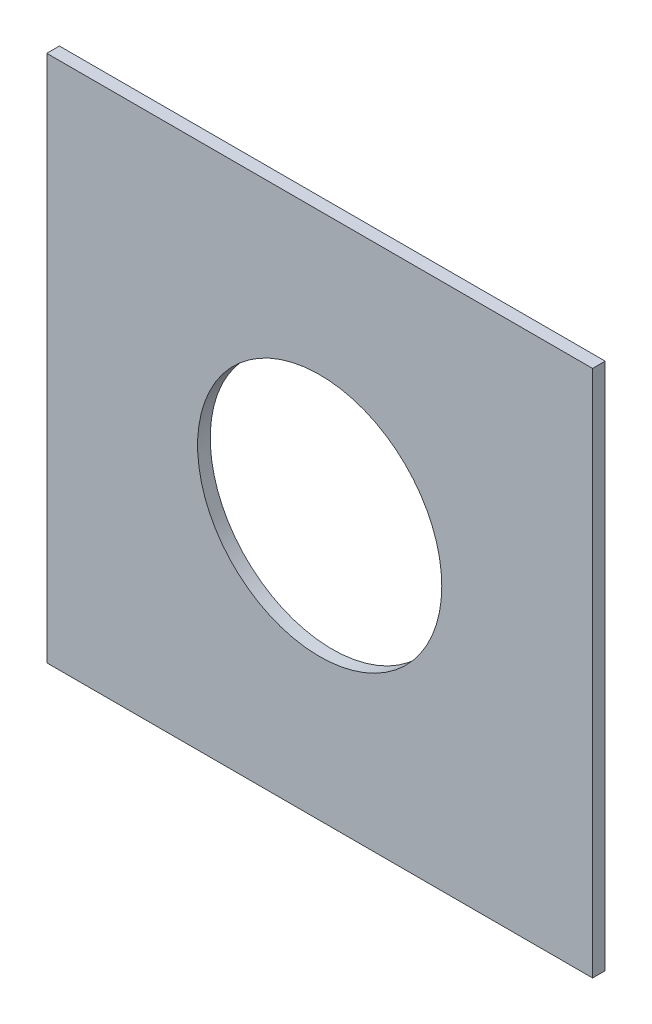
ISO-10303-21;
HEADER;
FILE_DESCRIPTION(('STEP AP214'),'2;1');
FILE_NAME('part.step','',(''),(''),'','','');
FILE_SCHEMA(('AUTOMOTIVE_DESIGN { 1 0 10303 214 1 1 1 1 }'));
ENDSEC;
DATA;
#1=APPLICATION_CONTEXT('core data for automotive mechanical design processes');
#2=APPLICATION_PROTOCOL_DEFINITION('international standard','automotive_design',2000,#1);
#3=PRODUCT_CONTEXT('',#1,'mechanical');
#4=PRODUCT('Part','Part','',(#3));
#5=PRODUCT_RELATED_PRODUCT_CATEGORY('part','',(#4));
#6=PRODUCT_DEFINITION_FORMATION('','',#4);
#7=PRODUCT_DEFINITION_CONTEXT('part definition',#1,'design');
#8=PRODUCT_DEFINITION('design','',#6,#7);
#9=PRODUCT_DEFINITION_SHAPE('','',#8);
#10=(LENGTH_UNIT() NAMED_UNIT(*) SI_UNIT(.MILLI.,.METRE.));
#11=(NAMED_UNIT(*) PLANE_ANGLE_UNIT() SI_UNIT($,.RADIAN.));
#12=(NAMED_UNIT(*) SI_UNIT($,.STERADIAN.) SOLID_ANGLE_UNIT());
#13=UNCERTAINTY_MEASURE_WITH_UNIT(LENGTH_MEASURE(1.E-05),#10,'distance_accuracy_value','');
#14=(GEOMETRIC_REPRESENTATION_CONTEXT(3) GLOBAL_UNCERTAINTY_ASSIGNED_CONTEXT((#13)) GLOBAL_UNIT_ASSIGNED_CONTEXT((#10,
#11,#12)) REPRESENTATION_CONTEXT('',''));
#15=CARTESIAN_POINT('',(0.,0.,0.));
#16=DIRECTION('',(0.,0.,1.));
#17=DIRECTION('',(1.,0.,0.));
#18=AXIS2_PLACEMENT_3D('',#15,#16,#17);
#19=CARTESIAN_POINT('',(120.65,-116.6880064,5.588));
#20=DIRECTION('',(-1.,0.,0.));
#21=DIRECTION('',(0.,0.,1.));
#22=AXIS2_PLACEMENT_3D('',#19,#20,#21);
#23=PLANE('',#22);
#24=DIRECTION('',(0.,1.,0.));
#25=VECTOR('',#24,1.);
#26=CARTESIAN_POINT('',(120.65,-116.6880064,0.));
#27=LINE('',#26,#25);
#28=CARTESIAN_POINT('',(120.65,-116.6880064,0.));
#29=VERTEX_POINT('',#28);
#30=CARTESIAN_POINT('',(120.65,116.6880064,0.));
#31=VERTEX_POINT('',#30);
#32=EDGE_CURVE('E100',#29,#31,#27,.T.);
#33=ORIENTED_EDGE('',*,*,#32,.T.);
#34=DIRECTION('',(0.,0.,-1.));
#35=VECTOR('',#34,1.);
#36=CARTESIAN_POINT('',(120.65,116.6880064,5.588));
#37=LINE('',#36,#35);
#38=CARTESIAN_POINT('',(120.65,116.6880064,5.588));
#39=VERTEX_POINT('',#38);
#40=EDGE_CURVE('E11',#39,#31,#37,.T.);
#41=ORIENTED_EDGE('',*,*,#40,.F.);
#42=DIRECTION('',(0.,1.,0.));
#43=VECTOR('',#42,1.);
#44=CARTESIAN_POINT('',(120.65,-116.6880064,5.588));
#45=LINE('',#44,#43);
#46=CARTESIAN_POINT('',(120.65,-116.6880064,5.588));
#47=VERTEX_POINT('',#46);
#48=EDGE_CURVE('E88',#47,#39,#45,.T.);
#49=ORIENTED_EDGE('',*,*,#48,.F.);
#50=DIRECTION('',(0.,0.,-1.));
#51=VECTOR('',#50,1.);
#52=CARTESIAN_POINT('',(120.65,-116.6880064,5.588));
#53=LINE('',#52,#51);
#54=EDGE_CURVE('E96',#47,#29,#53,.T.);
#55=ORIENTED_EDGE('',*,*,#54,.T.);
#56=EDGE_LOOP('',(#33,#41,#49,#55));
#57=FACE_BOUND('',#56,.T.);
#58=ADVANCED_FACE('F37',(#57),#23,.F.);
#59=CARTESIAN_POINT('',(-120.65,116.6880064,5.588));
#60=DIRECTION('',(0.,-1.,0.));
#61=DIRECTION('',(0.,0.,-1.));
#62=AXIS2_PLACEMENT_3D('',#59,#60,#61);
#63=PLANE('',#62);
#64=DIRECTION('',(-1.,0.,0.));
#65=VECTOR('',#64,1.);
#66=CARTESIAN_POINT('',(-120.65,116.6880064,0.));
#67=LINE('',#66,#65);
#68=CARTESIAN_POINT('',(-120.65,116.6880064,0.));
#69=VERTEX_POINT('',#68);
#70=EDGE_CURVE('E92',#31,#69,#67,.T.);
#71=ORIENTED_EDGE('',*,*,#70,.T.);
#72=DIRECTION('',(0.,0.,-1.));
#73=VECTOR('',#72,1.);
#74=CARTESIAN_POINT('',(-120.65,116.6880064,5.588));
#75=LINE('',#74,#73);
#76=CARTESIAN_POINT('',(-120.65,116.6880064,5.588));
#77=VERTEX_POINT('',#76);
#78=EDGE_CURVE('E45',#77,#69,#75,.T.);
#79=ORIENTED_EDGE('',*,*,#78,.F.);
#80=DIRECTION('',(-1.,0.,0.));
#81=VECTOR('',#80,1.);
#82=CARTESIAN_POINT('',(-120.65,116.6880064,5.588));
#83=LINE('',#82,#81);
#84=EDGE_CURVE('E83',#39,#77,#83,.T.);
#85=ORIENTED_EDGE('',*,*,#84,.F.);
#86=ORIENTED_EDGE('',*,*,#40,.T.);
#87=EDGE_LOOP('',(#71,#79,#85,#86));
#88=FACE_BOUND('',#87,.T.);
#89=ADVANCED_FACE('F91',(#88),#63,.F.);
#90=CARTESIAN_POINT('',(-120.65,-116.6880064,5.588));
#91=DIRECTION('',(1.,0.,0.));
#92=DIRECTION('',(0.,0.,-1.));
#93=AXIS2_PLACEMENT_3D('',#90,#91,#92);
#94=PLANE('',#93);
#95=DIRECTION('',(0.,-1.,0.));
#96=VECTOR('',#95,1.);
#97=CARTESIAN_POINT('',(-120.65,-116.6880064,0.));
#98=LINE('',#97,#96);
#99=CARTESIAN_POINT('',(-120.65,-116.6880064,0.));
#100=VERTEX_POINT('',#99);
#101=EDGE_CURVE('E70',#69,#100,#98,.T.);
#102=ORIENTED_EDGE('',*,*,#101,.T.);
#103=DIRECTION('',(0.,0.,-1.));
#104=VECTOR('',#103,1.);
#105=CARTESIAN_POINT('',(-120.65,-116.6880064,5.588));
#106=LINE('',#105,#104);
#107=CARTESIAN_POINT('',(-120.65,-116.6880064,5.588));
#108=VERTEX_POINT('',#107);
#109=EDGE_CURVE('E93',#108,#100,#106,.T.);
#110=ORIENTED_EDGE('',*,*,#109,.F.);
#111=DIRECTION('',(0.,-1.,0.));
#112=VECTOR('',#111,1.);
#113=CARTESIAN_POINT('',(-120.65,-116.6880064,5.588));
#114=LINE('',#113,#112);
#115=EDGE_CURVE('E86',#77,#108,#114,.T.);
#116=ORIENTED_EDGE('',*,*,#115,.F.);
#117=ORIENTED_EDGE('',*,*,#78,.T.);
#118=EDGE_LOOP('',(#102,#110,#116,#117));
#119=FACE_BOUND('',#118,.T.);
#120=ADVANCED_FACE('F94',(#119),#94,.F.);
#121=CARTESIAN_POINT('',(-120.65,-116.6880064,5.588));
#122=DIRECTION('',(0.,1.,0.));
#123=DIRECTION('',(0.,0.,1.));
#124=AXIS2_PLACEMENT_3D('',#121,#122,#123);
#125=PLANE('',#124);
#126=DIRECTION('',(1.,0.,0.));
#127=VECTOR('',#126,1.);
#128=CARTESIAN_POINT('',(-120.65,-116.6880064,0.));
#129=LINE('',#128,#127);
#130=EDGE_CURVE('E76',#100,#29,#129,.T.);
#131=ORIENTED_EDGE('',*,*,#130,.T.);
#132=ORIENTED_EDGE('',*,*,#54,.F.);
#133=DIRECTION('',(1.,0.,0.));
#134=VECTOR('',#133,1.);
#135=CARTESIAN_POINT('',(-120.65,-116.6880064,5.588));
#136=LINE('',#135,#134);
#137=EDGE_CURVE('E53',#108,#47,#136,.T.);
#138=ORIENTED_EDGE('',*,*,#137,.F.);
#139=ORIENTED_EDGE('',*,*,#109,.T.);
#140=EDGE_LOOP('',(#131,#132,#138,#139));
#141=FACE_BOUND('',#140,.T.);
#142=ADVANCED_FACE('F108',(#141),#125,.F.);
#143=CARTESIAN_POINT('',(0.,0.,5.588));
#144=DIRECTION('',(0.,0.,-1.));
#145=DIRECTION('',(-1.,0.,0.));
#146=AXIS2_PLACEMENT_3D('',#143,#144,#145);
#147=PLANE('',#146);
#148=CARTESIAN_POINT('',(0.,0.,5.588));
#149=DIRECTION('',(0.,0.,1.));
#150=DIRECTION('',(1.,0.,0.));
#151=AXIS2_PLACEMENT_3D('',#148,#149,#150);
#152=CIRCLE('',#151,53.975);
#153=CARTESIAN_POINT('',(53.975,0.,5.588));
#154=VERTEX_POINT('',#153);
#155=EDGE_CURVE('E114',#154,#154,#152,.T.);
#156=ORIENTED_EDGE('',*,*,#155,.F.);
#157=EDGE_LOOP('',(#156));
#158=FACE_BOUND('',#157,.T.);
#159=ORIENTED_EDGE('',*,*,#48,.T.);
#160=ORIENTED_EDGE('',*,*,#84,.T.);
#161=ORIENTED_EDGE('',*,*,#115,.T.);
#162=ORIENTED_EDGE('',*,*,#137,.T.);
#163=EDGE_LOOP('',(#159,#160,#161,#162));
#164=FACE_BOUND('',#163,.T.);
#165=ADVANCED_FACE('F84',(#158,#164),#147,.F.);
#166=CARTESIAN_POINT('',(0.,0.,0.));
#167=DIRECTION('',(0.,0.,-1.));
#168=DIRECTION('',(-1.,0.,0.));
#169=AXIS2_PLACEMENT_3D('',#166,#167,#168);
#170=PLANE('',#169);
#171=CARTESIAN_POINT('',(0.,0.,0.));
#172=DIRECTION('',(0.,0.,1.));
#173=DIRECTION('',(1.,0.,0.));
#174=AXIS2_PLACEMENT_3D('',#171,#172,#173);
#175=CIRCLE('',#174,53.975);
#176=CARTESIAN_POINT('',(53.975,0.,0.));
#177=VERTEX_POINT('',#176);
#178=EDGE_CURVE('E103',#177,#177,#175,.T.);
#179=ORIENTED_EDGE('',*,*,#178,.T.);
#180=EDGE_LOOP('',(#179));
#181=FACE_BOUND('',#180,.T.);
#182=ORIENTED_EDGE('',*,*,#32,.F.);
#183=ORIENTED_EDGE('',*,*,#130,.F.);
#184=ORIENTED_EDGE('',*,*,#101,.F.);
#185=ORIENTED_EDGE('',*,*,#70,.F.);
#186=EDGE_LOOP('',(#182,#183,#184,#185));
#187=FACE_BOUND('',#186,.T.);
#188=ADVANCED_FACE('F111',(#181,#187),#170,.T.);
#189=CARTESIAN_POINT('',(0.,0.,0.));
#190=DIRECTION('',(0.,0.,1.));
#191=DIRECTION('',(1.,0.,0.));
#192=AXIS2_PLACEMENT_3D('',#189,#190,#191);
#193=CYLINDRICAL_SURFACE('',#192,53.975);
#194=ORIENTED_EDGE('',*,*,#178,.F.);
#195=EDGE_LOOP('',(#194));
#196=FACE_BOUND('',#195,.T.);
#197=ORIENTED_EDGE('',*,*,#155,.T.);
#198=EDGE_LOOP('',(#197));
#199=FACE_BOUND('',#198,.T.);
#200=ADVANCED_FACE('F121',(#196,#199),#193,.F.);
#201=CLOSED_SHELL('',(#58,#89,#120,#142,#165,#188,#200));
#202=MANIFOLD_SOLID_BREP('B2',#201);
#203=ADVANCED_BREP_SHAPE_REPRESENTATION('',(#18,#202),#14);
#204=SHAPE_DEFINITION_REPRESENTATION(#9,#203);
ENDSEC;
END-ISO-10303-21;
